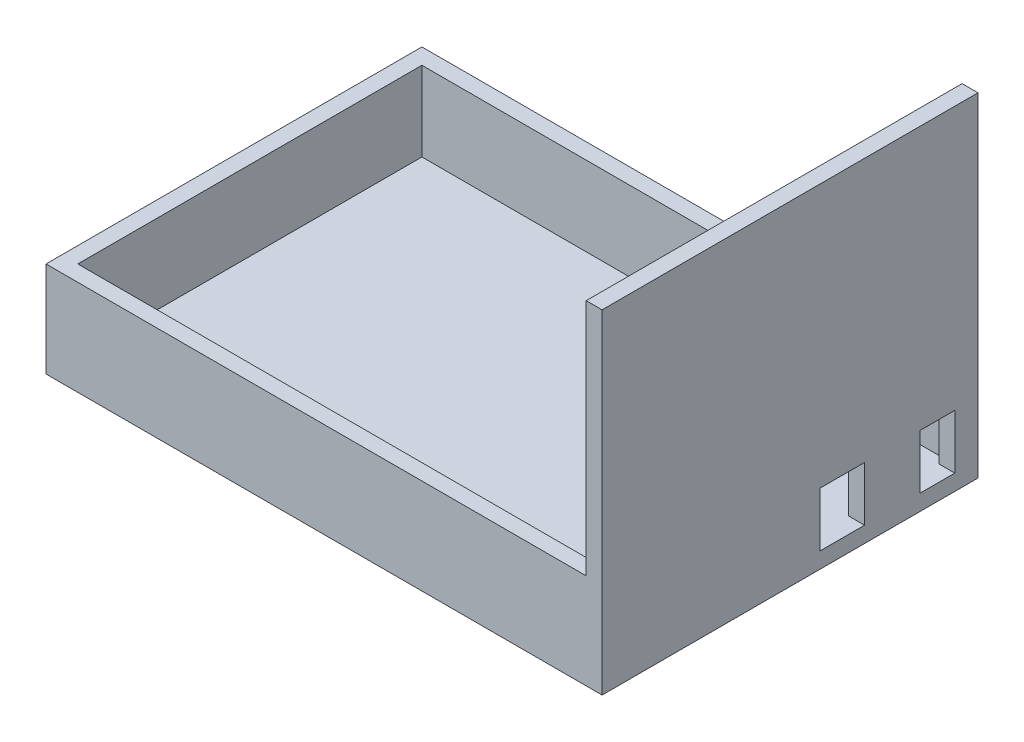
ISO-10303-21;
HEADER;
FILE_DESCRIPTION(('STEP AP214'),'2;1');
FILE_NAME('part.step','',(''),(''),'','','');
FILE_SCHEMA(('AUTOMOTIVE_DESIGN { 1 0 10303 214 1 1 1 1 }'));
ENDSEC;
DATA;
#1=APPLICATION_CONTEXT('core data for automotive mechanical design processes');
#2=APPLICATION_PROTOCOL_DEFINITION('international standard','automotive_design',2000,#1);
#3=PRODUCT_CONTEXT('',#1,'mechanical');
#4=PRODUCT('Part','Part','',(#3));
#5=PRODUCT_RELATED_PRODUCT_CATEGORY('part','',(#4));
#6=PRODUCT_DEFINITION_FORMATION('','',#4);
#7=PRODUCT_DEFINITION_CONTEXT('part definition',#1,'design');
#8=PRODUCT_DEFINITION('design','',#6,#7);
#9=PRODUCT_DEFINITION_SHAPE('','',#8);
#10=(LENGTH_UNIT() NAMED_UNIT(*) SI_UNIT(.MILLI.,.METRE.));
#11=(NAMED_UNIT(*) PLANE_ANGLE_UNIT() SI_UNIT($,.RADIAN.));
#12=(NAMED_UNIT(*) SI_UNIT($,.STERADIAN.) SOLID_ANGLE_UNIT());
#13=UNCERTAINTY_MEASURE_WITH_UNIT(LENGTH_MEASURE(1.E-05),#10,'distance_accuracy_value','');
#14=(GEOMETRIC_REPRESENTATION_CONTEXT(3) GLOBAL_UNCERTAINTY_ASSIGNED_CONTEXT((#13)) GLOBAL_UNIT_ASSIGNED_CONTEXT((#10,
#11,#12)) REPRESENTATION_CONTEXT('',''));
#15=CARTESIAN_POINT('',(0.,0.,0.));
#16=DIRECTION('',(0.,0.,1.));
#17=DIRECTION('',(1.,0.,0.));
#18=AXIS2_PLACEMENT_3D('',#15,#16,#17);
#19=CARTESIAN_POINT('',(0.,5.,0.));
#20=DIRECTION('',(0.,1.,0.));
#21=DIRECTION('',(0.,0.,1.));
#22=AXIS2_PLACEMENT_3D('',#19,#20,#21);
#23=PLANE('',#22);
#24=DIRECTION('',(0.,0.,1.));
#25=VECTOR('',#24,1.);
#26=CARTESIAN_POINT('',(82.5,5.,-59.15));
#27=LINE('',#26,#25);
#28=CARTESIAN_POINT('',(82.5,5.,-54.15));
#29=VERTEX_POINT('',#28);
#30=CARTESIAN_POINT('',(82.5,5.,-51.85));
#31=VERTEX_POINT('',#30);
#32=EDGE_CURVE('E249',#29,#31,#27,.T.);
#33=ORIENTED_EDGE('',*,*,#32,.F.);
#34=DIRECTION('',(1.,0.,0.));
#35=VECTOR('',#34,1.);
#36=CARTESIAN_POINT('',(-82.5,5.,-54.15));
#37=LINE('',#36,#35);
#38=CARTESIAN_POINT('',(-82.5,5.,-54.15));
#39=VERTEX_POINT('',#38);
#40=EDGE_CURVE('E211',#39,#29,#37,.T.);
#41=ORIENTED_EDGE('',*,*,#40,.F.);
#42=DIRECTION('',(0.,0.,-1.));
#43=VECTOR('',#42,1.);
#44=CARTESIAN_POINT('',(-82.5,5.,-59.15));
#45=LINE('',#44,#43);
#46=CARTESIAN_POINT('',(-82.5,5.,54.15));
#47=VERTEX_POINT('',#46);
#48=EDGE_CURVE('E264',#47,#39,#45,.T.);
#49=ORIENTED_EDGE('',*,*,#48,.F.);
#50=DIRECTION('',(-1.,0.,0.));
#51=VECTOR('',#50,1.);
#52=CARTESIAN_POINT('',(-82.5,5.,54.15));
#53=LINE('',#52,#51);
#54=CARTESIAN_POINT('',(82.5,5.,54.15));
#55=VERTEX_POINT('',#54);
#56=EDGE_CURVE('E230',#55,#47,#53,.T.);
#57=ORIENTED_EDGE('',*,*,#56,.F.);
#58=CARTESIAN_POINT('',(82.5,5.,-9.44999999999999));
#59=VERTEX_POINT('',#58);
#60=EDGE_CURVE('E244',#59,#55,#27,.T.);
#61=ORIENTED_EDGE('',*,*,#60,.F.);
#62=DIRECTION('',(1.,0.,0.));
#63=VECTOR('',#62,1.);
#64=CARTESIAN_POINT('',(-87.501,5.,-9.44999999999999));
#65=LINE('',#64,#63);
#66=CARTESIAN_POINT('',(87.5,5.,-9.44999999999999));
#67=VERTEX_POINT('',#66);
#68=EDGE_CURVE('E214',#59,#67,#65,.T.);
#69=ORIENTED_EDGE('',*,*,#68,.T.);
#70=DIRECTION('',(0.,0.,-1.));
#71=VECTOR('',#70,1.);
#72=CARTESIAN_POINT('',(87.5,5.,-23.45));
#73=LINE('',#72,#71);
#74=CARTESIAN_POINT('',(87.5,5.,-23.45));
#75=VERTEX_POINT('',#74);
#76=EDGE_CURVE('E195',#67,#75,#73,.T.);
#77=ORIENTED_EDGE('',*,*,#76,.T.);
#78=DIRECTION('',(1.,0.,0.));
#79=VECTOR('',#78,1.);
#80=CARTESIAN_POINT('',(-87.501,5.,-23.45));
#81=LINE('',#80,#79);
#82=CARTESIAN_POINT('',(82.5,5.,-23.45));
#83=VERTEX_POINT('',#82);
#84=EDGE_CURVE('E212',#83,#75,#81,.T.);
#85=ORIENTED_EDGE('',*,*,#84,.F.);
#86=CARTESIAN_POINT('',(82.5,5.,-40.95));
#87=VERTEX_POINT('',#86);
#88=EDGE_CURVE('E258',#87,#83,#27,.T.);
#89=ORIENTED_EDGE('',*,*,#88,.F.);
#90=DIRECTION('',(1.,0.,0.));
#91=VECTOR('',#90,1.);
#92=CARTESIAN_POINT('',(-87.501,5.,-40.95));
#93=LINE('',#92,#91);
#94=CARTESIAN_POINT('',(87.5,5.,-40.95));
#95=VERTEX_POINT('',#94);
#96=EDGE_CURVE('E172',#87,#95,#93,.T.);
#97=ORIENTED_EDGE('',*,*,#96,.T.);
#98=DIRECTION('',(0.,0.,-1.));
#99=VECTOR('',#98,1.);
#100=CARTESIAN_POINT('',(87.5,5.,-40.95));
#101=LINE('',#100,#99);
#102=CARTESIAN_POINT('',(87.5,5.,-51.85));
#103=VERTEX_POINT('',#102);
#104=EDGE_CURVE('E533',#95,#103,#101,.T.);
#105=ORIENTED_EDGE('',*,*,#104,.T.);
#106=DIRECTION('',(1.,0.,0.));
#107=VECTOR('',#106,1.);
#108=CARTESIAN_POINT('',(-87.501,5.,-51.85));
#109=LINE('',#108,#107);
#110=EDGE_CURVE('E188',#31,#103,#109,.T.);
#111=ORIENTED_EDGE('',*,*,#110,.F.);
#112=EDGE_LOOP('',(#33,#41,#49,#57,#61,#69,#77,#85,#89,#97,#105,#111));
#113=FACE_BOUND('',#112,.T.);
#114=ADVANCED_FACE('F39',(#113),#23,.T.);
#115=CARTESIAN_POINT('',(-82.5,30.,-59.15));
#116=DIRECTION('',(-1.,0.,0.));
#117=DIRECTION('',(0.,0.,1.));
#118=AXIS2_PLACEMENT_3D('',#115,#116,#117);
#119=PLANE('',#118);
#120=DIRECTION('',(0.,-1.,0.));
#121=VECTOR('',#120,1.);
#122=CARTESIAN_POINT('',(-82.5,30.,-54.15));
#123=LINE('',#122,#121);
#124=CARTESIAN_POINT('',(-82.5,30.,-54.15));
#125=VERTEX_POINT('',#124);
#126=EDGE_CURVE('E228',#125,#39,#123,.T.);
#127=ORIENTED_EDGE('',*,*,#126,.F.);
#128=DIRECTION('',(0.,0.,-1.));
#129=VECTOR('',#128,1.);
#130=CARTESIAN_POINT('',(-82.5,30.,-59.15));
#131=LINE('',#130,#129);
#132=CARTESIAN_POINT('',(-82.5,30.,54.15));
#133=VERTEX_POINT('',#132);
#134=EDGE_CURVE('E270',#133,#125,#131,.T.);
#135=ORIENTED_EDGE('',*,*,#134,.F.);
#136=DIRECTION('',(0.,-1.,0.));
#137=VECTOR('',#136,1.);
#138=CARTESIAN_POINT('',(-82.5,30.,54.15));
#139=LINE('',#138,#137);
#140=EDGE_CURVE('E237',#133,#47,#139,.T.);
#141=ORIENTED_EDGE('',*,*,#140,.T.);
#142=ORIENTED_EDGE('',*,*,#48,.T.);
#143=EDGE_LOOP('',(#127,#135,#141,#142));
#144=FACE_BOUND('',#143,.T.);
#145=ADVANCED_FACE('F325',(#144),#119,.F.);
#146=CARTESIAN_POINT('',(82.5,105.,-59.15));
#147=DIRECTION('',(1.,0.,0.));
#148=DIRECTION('',(0.,0.,-1.));
#149=AXIS2_PLACEMENT_3D('',#146,#147,#148);
#150=PLANE('',#149);
#151=DIRECTION('',(0.,0.,-1.));
#152=VECTOR('',#151,1.);
#153=CARTESIAN_POINT('',(82.5,22.1,-40.95));
#154=LINE('',#153,#152);
#155=CARTESIAN_POINT('',(82.5,22.1,-40.95));
#156=VERTEX_POINT('',#155);
#157=CARTESIAN_POINT('',(82.5,22.1,-51.85));
#158=VERTEX_POINT('',#157);
#159=EDGE_CURVE('E168',#156,#158,#154,.T.);
#160=ORIENTED_EDGE('',*,*,#159,.F.);
#161=DIRECTION('',(0.,1.,0.));
#162=VECTOR('',#161,1.);
#163=CARTESIAN_POINT('',(82.5,22.1,-40.95));
#164=LINE('',#163,#162);
#165=EDGE_CURVE('E175',#87,#156,#164,.T.);
#166=ORIENTED_EDGE('',*,*,#165,.F.);
#167=ORIENTED_EDGE('',*,*,#88,.T.);
#168=DIRECTION('',(0.,-1.,0.));
#169=VECTOR('',#168,1.);
#170=CARTESIAN_POINT('',(82.5,22.1,-23.45));
#171=LINE('',#170,#169);
#172=CARTESIAN_POINT('',(82.5,22.1,-23.45));
#173=VERTEX_POINT('',#172);
#174=EDGE_CURVE('E194',#173,#83,#171,.T.);
#175=ORIENTED_EDGE('',*,*,#174,.F.);
#176=DIRECTION('',(0.,0.,-1.));
#177=VECTOR('',#176,1.);
#178=CARTESIAN_POINT('',(82.5,22.1,-23.45));
#179=LINE('',#178,#177);
#180=CARTESIAN_POINT('',(82.5,22.1,-9.44999999999999));
#181=VERTEX_POINT('',#180);
#182=EDGE_CURVE('E191',#181,#173,#179,.T.);
#183=ORIENTED_EDGE('',*,*,#182,.F.);
#184=DIRECTION('',(0.,1.,0.));
#185=VECTOR('',#184,1.);
#186=CARTESIAN_POINT('',(82.5,22.1,-9.44999999999999));
#187=LINE('',#186,#185);
#188=EDGE_CURVE('E209',#59,#181,#187,.T.);
#189=ORIENTED_EDGE('',*,*,#188,.F.);
#190=ORIENTED_EDGE('',*,*,#60,.T.);
#191=DIRECTION('',(0.,-1.,0.));
#192=VECTOR('',#191,1.);
#193=CARTESIAN_POINT('',(82.5,30.,54.15));
#194=LINE('',#193,#192);
#195=CARTESIAN_POINT('',(82.5,30.,54.15));
#196=VERTEX_POINT('',#195);
#197=EDGE_CURVE('E241',#196,#55,#194,.T.);
#198=ORIENTED_EDGE('',*,*,#197,.F.);
#199=DIRECTION('',(0.,0.,-1.));
#200=VECTOR('',#199,1.);
#201=CARTESIAN_POINT('',(82.5,30.,59.15));
#202=LINE('',#201,#200);
#203=CARTESIAN_POINT('',(82.5,30.,59.15));
#204=VERTEX_POINT('',#203);
#205=EDGE_CURVE('E231',#204,#196,#202,.T.);
#206=ORIENTED_EDGE('',*,*,#205,.F.);
#207=DIRECTION('',(0.,-1.,0.));
#208=VECTOR('',#207,1.);
#209=CARTESIAN_POINT('',(82.5,105.,59.15));
#210=LINE('',#209,#208);
#211=CARTESIAN_POINT('',(82.5,105.,59.15));
#212=VERTEX_POINT('',#211);
#213=EDGE_CURVE('E256',#212,#204,#210,.T.);
#214=ORIENTED_EDGE('',*,*,#213,.F.);
#215=DIRECTION('',(0.,0.,1.));
#216=VECTOR('',#215,1.);
#217=CARTESIAN_POINT('',(82.5,105.,-59.15));
#218=LINE('',#217,#216);
#219=CARTESIAN_POINT('',(82.5,105.,-59.15));
#220=VERTEX_POINT('',#219);
#221=EDGE_CURVE('E251',#220,#212,#218,.T.);
#222=ORIENTED_EDGE('',*,*,#221,.F.);
#223=DIRECTION('',(0.,-1.,0.));
#224=VECTOR('',#223,1.);
#225=CARTESIAN_POINT('',(82.5,105.,-59.15));
#226=LINE('',#225,#224);
#227=CARTESIAN_POINT('',(82.5,30.,-59.15));
#228=VERTEX_POINT('',#227);
#229=EDGE_CURVE('E261',#220,#228,#226,.T.);
#230=ORIENTED_EDGE('',*,*,#229,.T.);
#231=DIRECTION('',(0.,0.,-1.));
#232=VECTOR('',#231,1.);
#233=CARTESIAN_POINT('',(82.5,30.,-59.15));
#234=LINE('',#233,#232);
#235=CARTESIAN_POINT('',(82.5,30.,-54.15));
#236=VERTEX_POINT('',#235);
#237=EDGE_CURVE('E221',#236,#228,#234,.T.);
#238=ORIENTED_EDGE('',*,*,#237,.F.);
#239=DIRECTION('',(0.,-1.,0.));
#240=VECTOR('',#239,1.);
#241=CARTESIAN_POINT('',(82.5,30.,-54.15));
#242=LINE('',#241,#240);
#243=EDGE_CURVE('E224',#236,#29,#242,.T.);
#244=ORIENTED_EDGE('',*,*,#243,.T.);
#245=ORIENTED_EDGE('',*,*,#32,.T.);
#246=DIRECTION('',(0.,-1.,0.));
#247=VECTOR('',#246,1.);
#248=CARTESIAN_POINT('',(82.5,22.1,-51.85));
#249=LINE('',#248,#247);
#250=EDGE_CURVE('E54',#158,#31,#249,.T.);
#251=ORIENTED_EDGE('',*,*,#250,.F.);
#252=EDGE_LOOP('',(#160,#166,#167,#175,#183,#189,#190,#198,#206,#214,#222,#230,#238,#244,#245,#251));
#253=FACE_BOUND('',#252,.T.);
#254=ADVANCED_FACE('F180',(#253),#150,.F.);
#255=CARTESIAN_POINT('',(87.5,5.,-59.15));
#256=DIRECTION('',(-1.,0.,0.));
#257=DIRECTION('',(0.,0.,1.));
#258=AXIS2_PLACEMENT_3D('',#255,#256,#257);
#259=PLANE('',#258);
#260=ORIENTED_EDGE('',*,*,#104,.F.);
#261=DIRECTION('',(0.,-1.,0.));
#262=VECTOR('',#261,1.);
#263=CARTESIAN_POINT('',(87.5,22.1,-40.95));
#264=LINE('',#263,#262);
#265=CARTESIAN_POINT('',(87.5,22.1,-40.95));
#266=VERTEX_POINT('',#265);
#267=EDGE_CURVE('E62',#266,#95,#264,.T.);
#268=ORIENTED_EDGE('',*,*,#267,.F.);
#269=DIRECTION('',(0.,0.,1.));
#270=VECTOR('',#269,1.);
#271=CARTESIAN_POINT('',(87.5,22.1,-40.95));
#272=LINE('',#271,#270);
#273=CARTESIAN_POINT('',(87.5,22.1,-51.85));
#274=VERTEX_POINT('',#273);
#275=EDGE_CURVE('E170',#274,#266,#272,.T.);
#276=ORIENTED_EDGE('',*,*,#275,.F.);
#277=DIRECTION('',(0.,1.,0.));
#278=VECTOR('',#277,1.);
#279=CARTESIAN_POINT('',(87.5,22.1,-51.85));
#280=LINE('',#279,#278);
#281=EDGE_CURVE('E536',#103,#274,#280,.T.);
#282=ORIENTED_EDGE('',*,*,#281,.F.);
#283=EDGE_LOOP('',(#260,#268,#276,#282));
#284=FACE_BOUND('',#283,.T.);
#285=DIRECTION('',(0.,0.,1.));
#286=VECTOR('',#285,1.);
#287=CARTESIAN_POINT('',(87.5,22.1,-23.45));
#288=LINE('',#287,#286);
#289=CARTESIAN_POINT('',(87.5,22.1,-23.45));
#290=VERTEX_POINT('',#289);
#291=CARTESIAN_POINT('',(87.5,22.1,-9.44999999999999));
#292=VERTEX_POINT('',#291);
#293=EDGE_CURVE('E201',#290,#292,#288,.T.);
#294=ORIENTED_EDGE('',*,*,#293,.F.);
#295=DIRECTION('',(0.,1.,0.));
#296=VECTOR('',#295,1.);
#297=CARTESIAN_POINT('',(87.5,22.1,-23.45));
#298=LINE('',#297,#296);
#299=EDGE_CURVE('E204',#75,#290,#298,.T.);
#300=ORIENTED_EDGE('',*,*,#299,.F.);
#301=ORIENTED_EDGE('',*,*,#76,.F.);
#302=DIRECTION('',(0.,-1.,0.));
#303=VECTOR('',#302,1.);
#304=CARTESIAN_POINT('',(87.5,22.1,-9.44999999999999));
#305=LINE('',#304,#303);
#306=EDGE_CURVE('E198',#292,#67,#305,.T.);
#307=ORIENTED_EDGE('',*,*,#306,.F.);
#308=EDGE_LOOP('',(#294,#300,#301,#307));
#309=FACE_BOUND('',#308,.T.);
#310=DIRECTION('',(0.,0.,-1.));
#311=VECTOR('',#310,1.);
#312=CARTESIAN_POINT('',(87.5,0.,-59.15));
#313=LINE('',#312,#311);
#314=CARTESIAN_POINT('',(87.5,0.,59.15));
#315=VERTEX_POINT('',#314);
#316=CARTESIAN_POINT('',(87.5,0.,-59.15));
#317=VERTEX_POINT('',#316);
#318=EDGE_CURVE('E276',#315,#317,#313,.T.);
#319=ORIENTED_EDGE('',*,*,#318,.T.);
#320=DIRECTION('',(0.,-1.,0.));
#321=VECTOR('',#320,1.);
#322=CARTESIAN_POINT('',(87.5,5.,-59.15));
#323=LINE('',#322,#321);
#324=CARTESIAN_POINT('',(87.5,105.,-59.15));
#325=VERTEX_POINT('',#324);
#326=EDGE_CURVE('E11',#325,#317,#323,.T.);
#327=ORIENTED_EDGE('',*,*,#326,.F.);
#328=DIRECTION('',(0.,0.,-1.));
#329=VECTOR('',#328,1.);
#330=CARTESIAN_POINT('',(87.5,105.,-59.15));
#331=LINE('',#330,#329);
#332=CARTESIAN_POINT('',(87.5,105.,59.15));
#333=VERTEX_POINT('',#332);
#334=EDGE_CURVE('E245',#333,#325,#331,.T.);
#335=ORIENTED_EDGE('',*,*,#334,.F.);
#336=DIRECTION('',(0.,-1.,0.));
#337=VECTOR('',#336,1.);
#338=CARTESIAN_POINT('',(87.5,5.,59.15));
#339=LINE('',#338,#337);
#340=EDGE_CURVE('E287',#333,#315,#339,.T.);
#341=ORIENTED_EDGE('',*,*,#340,.T.);
#342=EDGE_LOOP('',(#319,#327,#335,#341));
#343=FACE_BOUND('',#342,.T.);
#344=ADVANCED_FACE('F41',(#284,#309,#343),#259,.F.);
#345=CARTESIAN_POINT('',(-87.5,5.,-59.15));
#346=DIRECTION('',(0.,0.,1.));
#347=DIRECTION('',(1.,0.,0.));
#348=AXIS2_PLACEMENT_3D('',#345,#346,#347);
#349=PLANE('',#348);
#350=DIRECTION('',(-1.,0.,0.));
#351=VECTOR('',#350,1.);
#352=CARTESIAN_POINT('',(-87.5,0.,-59.15));
#353=LINE('',#352,#351);
#354=CARTESIAN_POINT('',(-87.5,0.,-59.15));
#355=VERTEX_POINT('',#354);
#356=EDGE_CURVE('E281',#317,#355,#353,.T.);
#357=ORIENTED_EDGE('',*,*,#356,.T.);
#358=DIRECTION('',(0.,-1.,0.));
#359=VECTOR('',#358,1.);
#360=CARTESIAN_POINT('',(-87.5,5.,-59.15));
#361=LINE('',#360,#359);
#362=CARTESIAN_POINT('',(-87.5,30.,-59.15));
#363=VERTEX_POINT('',#362);
#364=EDGE_CURVE('E47',#363,#355,#361,.T.);
#365=ORIENTED_EDGE('',*,*,#364,.F.);
#366=DIRECTION('',(-1.,0.,0.));
#367=VECTOR('',#366,1.);
#368=CARTESIAN_POINT('',(-87.5,30.,-59.15));
#369=LINE('',#368,#367);
#370=EDGE_CURVE('E273',#228,#363,#369,.T.);
#371=ORIENTED_EDGE('',*,*,#370,.F.);
#372=ORIENTED_EDGE('',*,*,#229,.F.);
#373=DIRECTION('',(-1.,0.,0.));
#374=VECTOR('',#373,1.);
#375=CARTESIAN_POINT('',(87.5,105.,-59.15));
#376=LINE('',#375,#374);
#377=EDGE_CURVE('E248',#325,#220,#376,.T.);
#378=ORIENTED_EDGE('',*,*,#377,.F.);
#379=ORIENTED_EDGE('',*,*,#326,.T.);
#380=EDGE_LOOP('',(#357,#365,#371,#372,#378,#379));
#381=FACE_BOUND('',#380,.T.);
#382=ADVANCED_FACE('F334',(#381),#349,.F.);
#383=CARTESIAN_POINT('',(-87.5,5.,-59.15));
#384=DIRECTION('',(1.,0.,0.));
#385=DIRECTION('',(0.,0.,-1.));
#386=AXIS2_PLACEMENT_3D('',#383,#384,#385);
#387=PLANE('',#386);
#388=DIRECTION('',(0.,0.,1.));
#389=VECTOR('',#388,1.);
#390=CARTESIAN_POINT('',(-87.5,0.,-59.15));
#391=LINE('',#390,#389);
#392=CARTESIAN_POINT('',(-87.5,0.,59.15));
#393=VERTEX_POINT('',#392);
#394=EDGE_CURVE('E283',#355,#393,#391,.T.);
#395=ORIENTED_EDGE('',*,*,#394,.T.);
#396=DIRECTION('',(0.,-1.,0.));
#397=VECTOR('',#396,1.);
#398=CARTESIAN_POINT('',(-87.5,5.,59.15));
#399=LINE('',#398,#397);
#400=CARTESIAN_POINT('',(-87.5,30.,59.15));
#401=VERTEX_POINT('',#400);
#402=EDGE_CURVE('E290',#401,#393,#399,.T.);
#403=ORIENTED_EDGE('',*,*,#402,.F.);
#404=DIRECTION('',(0.,0.,1.));
#405=VECTOR('',#404,1.);
#406=CARTESIAN_POINT('',(-87.5,30.,-59.15));
#407=LINE('',#406,#405);
#408=EDGE_CURVE('E265',#363,#401,#407,.T.);
#409=ORIENTED_EDGE('',*,*,#408,.F.);
#410=ORIENTED_EDGE('',*,*,#364,.T.);
#411=EDGE_LOOP('',(#395,#403,#409,#410));
#412=FACE_BOUND('',#411,.T.);
#413=ADVANCED_FACE('F296',(#412),#387,.F.);
#414=CARTESIAN_POINT('',(-87.5,5.,59.15));
#415=DIRECTION('',(0.,0.,-1.));
#416=DIRECTION('',(-1.,0.,0.));
#417=AXIS2_PLACEMENT_3D('',#414,#415,#416);
#418=PLANE('',#417);
#419=DIRECTION('',(1.,0.,0.));
#420=VECTOR('',#419,1.);
#421=CARTESIAN_POINT('',(-87.5,0.,59.15));
#422=LINE('',#421,#420);
#423=EDGE_CURVE('E285',#393,#315,#422,.T.);
#424=ORIENTED_EDGE('',*,*,#423,.T.);
#425=ORIENTED_EDGE('',*,*,#340,.F.);
#426=DIRECTION('',(1.,0.,0.));
#427=VECTOR('',#426,1.);
#428=CARTESIAN_POINT('',(87.5,105.,59.15));
#429=LINE('',#428,#427);
#430=EDGE_CURVE('E253',#212,#333,#429,.T.);
#431=ORIENTED_EDGE('',*,*,#430,.F.);
#432=ORIENTED_EDGE('',*,*,#213,.T.);
#433=DIRECTION('',(1.,0.,0.));
#434=VECTOR('',#433,1.);
#435=CARTESIAN_POINT('',(-87.5,30.,59.15));
#436=LINE('',#435,#434);
#437=EDGE_CURVE('E268',#401,#204,#436,.T.);
#438=ORIENTED_EDGE('',*,*,#437,.F.);
#439=ORIENTED_EDGE('',*,*,#402,.T.);
#440=EDGE_LOOP('',(#424,#425,#431,#432,#438,#439));
#441=FACE_BOUND('',#440,.T.);
#442=ADVANCED_FACE('F303',(#441),#418,.F.);
#443=CARTESIAN_POINT('',(0.,0.,0.));
#444=DIRECTION('',(0.,1.,0.));
#445=DIRECTION('',(0.,0.,1.));
#446=AXIS2_PLACEMENT_3D('',#443,#444,#445);
#447=PLANE('',#446);
#448=ORIENTED_EDGE('',*,*,#318,.F.);
#449=ORIENTED_EDGE('',*,*,#423,.F.);
#450=ORIENTED_EDGE('',*,*,#394,.F.);
#451=ORIENTED_EDGE('',*,*,#356,.F.);
#452=EDGE_LOOP('',(#448,#449,#450,#451));
#453=FACE_BOUND('',#452,.T.);
#454=ADVANCED_FACE('F301',(#453),#447,.F.);
#455=CARTESIAN_POINT('',(0.,30.,0.));
#456=DIRECTION('',(0.,1.,0.));
#457=DIRECTION('',(0.,0.,1.));
#458=AXIS2_PLACEMENT_3D('',#455,#456,#457);
#459=PLANE('',#458);
#460=ORIENTED_EDGE('',*,*,#408,.T.);
#461=ORIENTED_EDGE('',*,*,#437,.T.);
#462=ORIENTED_EDGE('',*,*,#205,.T.);
#463=DIRECTION('',(-1.,0.,0.));
#464=VECTOR('',#463,1.);
#465=CARTESIAN_POINT('',(-82.5,30.,54.15));
#466=LINE('',#465,#464);
#467=EDGE_CURVE('E234',#196,#133,#466,.T.);
#468=ORIENTED_EDGE('',*,*,#467,.T.);
#469=ORIENTED_EDGE('',*,*,#134,.T.);
#470=DIRECTION('',(1.,0.,0.));
#471=VECTOR('',#470,1.);
#472=CARTESIAN_POINT('',(-82.5,30.,-54.15));
#473=LINE('',#472,#471);
#474=EDGE_CURVE('E219',#125,#236,#473,.T.);
#475=ORIENTED_EDGE('',*,*,#474,.T.);
#476=ORIENTED_EDGE('',*,*,#237,.T.);
#477=ORIENTED_EDGE('',*,*,#370,.T.);
#478=EDGE_LOOP('',(#460,#461,#462,#468,#469,#475,#476,#477));
#479=FACE_BOUND('',#478,.T.);
#480=ADVANCED_FACE('F317',(#479),#459,.T.);
#481=CARTESIAN_POINT('',(0.,105.,0.));
#482=DIRECTION('',(0.,-1.,0.));
#483=DIRECTION('',(0.,0.,-1.));
#484=AXIS2_PLACEMENT_3D('',#481,#482,#483);
#485=PLANE('',#484);
#486=ORIENTED_EDGE('',*,*,#334,.T.);
#487=ORIENTED_EDGE('',*,*,#377,.T.);
#488=ORIENTED_EDGE('',*,*,#221,.T.);
#489=ORIENTED_EDGE('',*,*,#430,.T.);
#490=EDGE_LOOP('',(#486,#487,#488,#489));
#491=FACE_BOUND('',#490,.T.);
#492=ADVANCED_FACE('F310',(#491),#485,.F.);
#493=CARTESIAN_POINT('',(-82.5,30.,54.15));
#494=DIRECTION('',(0.,0.,1.));
#495=DIRECTION('',(0.,-1.,0.));
#496=AXIS2_PLACEMENT_3D('',#493,#494,#495);
#497=PLANE('',#496);
#498=ORIENTED_EDGE('',*,*,#56,.T.);
#499=ORIENTED_EDGE('',*,*,#140,.F.);
#500=ORIENTED_EDGE('',*,*,#467,.F.);
#501=ORIENTED_EDGE('',*,*,#197,.T.);
#502=EDGE_LOOP('',(#498,#499,#500,#501));
#503=FACE_BOUND('',#502,.T.);
#504=ADVANCED_FACE('F320',(#503),#497,.F.);
#505=CARTESIAN_POINT('',(-82.5,30.,-54.15));
#506=DIRECTION('',(0.,0.,-1.));
#507=DIRECTION('',(0.,1.,0.));
#508=AXIS2_PLACEMENT_3D('',#505,#506,#507);
#509=PLANE('',#508);
#510=ORIENTED_EDGE('',*,*,#40,.T.);
#511=ORIENTED_EDGE('',*,*,#243,.F.);
#512=ORIENTED_EDGE('',*,*,#474,.F.);
#513=ORIENTED_EDGE('',*,*,#126,.T.);
#514=EDGE_LOOP('',(#510,#511,#512,#513));
#515=FACE_BOUND('',#514,.T.);
#516=ADVANCED_FACE('F332',(#515),#509,.F.);
#517=CARTESIAN_POINT('',(-87.501,22.1,-23.45));
#518=DIRECTION('',(0.,0.,-1.));
#519=DIRECTION('',(0.,1.,0.));
#520=AXIS2_PLACEMENT_3D('',#517,#518,#519);
#521=PLANE('',#520);
#522=ORIENTED_EDGE('',*,*,#174,.T.);
#523=ORIENTED_EDGE('',*,*,#84,.T.);
#524=ORIENTED_EDGE('',*,*,#299,.T.);
#525=DIRECTION('',(1.,0.,0.));
#526=VECTOR('',#525,1.);
#527=CARTESIAN_POINT('',(-87.501,22.1,-23.45));
#528=LINE('',#527,#526);
#529=EDGE_CURVE('E183',#173,#290,#528,.T.);
#530=ORIENTED_EDGE('',*,*,#529,.F.);
#531=EDGE_LOOP('',(#522,#523,#524,#530));
#532=FACE_BOUND('',#531,.T.);
#533=ADVANCED_FACE('F388',(#532),#521,.F.);
#534=CARTESIAN_POINT('',(-87.501,22.1,-9.44999999999999));
#535=DIRECTION('',(0.,0.,1.));
#536=DIRECTION('',(0.,-1.,0.));
#537=AXIS2_PLACEMENT_3D('',#534,#535,#536);
#538=PLANE('',#537);
#539=ORIENTED_EDGE('',*,*,#188,.T.);
#540=DIRECTION('',(1.,0.,0.));
#541=VECTOR('',#540,1.);
#542=CARTESIAN_POINT('',(-87.501,22.1,-9.44999999999999));
#543=LINE('',#542,#541);
#544=EDGE_CURVE('E206',#181,#292,#543,.T.);
#545=ORIENTED_EDGE('',*,*,#544,.T.);
#546=ORIENTED_EDGE('',*,*,#306,.T.);
#547=ORIENTED_EDGE('',*,*,#68,.F.);
#548=EDGE_LOOP('',(#539,#545,#546,#547));
#549=FACE_BOUND('',#548,.T.);
#550=ADVANCED_FACE('F395',(#549),#538,.F.);
#551=CARTESIAN_POINT('',(-87.501,22.1,-23.45));
#552=DIRECTION('',(0.,1.,0.));
#553=DIRECTION('',(0.,0.,1.));
#554=AXIS2_PLACEMENT_3D('',#551,#552,#553);
#555=PLANE('',#554);
#556=ORIENTED_EDGE('',*,*,#182,.T.);
#557=ORIENTED_EDGE('',*,*,#529,.T.);
#558=ORIENTED_EDGE('',*,*,#293,.T.);
#559=ORIENTED_EDGE('',*,*,#544,.F.);
#560=EDGE_LOOP('',(#556,#557,#558,#559));
#561=FACE_BOUND('',#560,.T.);
#562=ADVANCED_FACE('F402',(#561),#555,.F.);
#563=CARTESIAN_POINT('',(-87.501,22.1,-40.95));
#564=DIRECTION('',(0.,0.,1.));
#565=DIRECTION('',(1.,0.,0.));
#566=AXIS2_PLACEMENT_3D('',#563,#564,#565);
#567=PLANE('',#566);
#568=ORIENTED_EDGE('',*,*,#165,.T.);
#569=DIRECTION('',(1.,0.,0.));
#570=VECTOR('',#569,1.);
#571=CARTESIAN_POINT('',(-87.501,22.1,-40.95));
#572=LINE('',#571,#570);
#573=EDGE_CURVE('E164',#156,#266,#572,.T.);
#574=ORIENTED_EDGE('',*,*,#573,.T.);
#575=ORIENTED_EDGE('',*,*,#267,.T.);
#576=ORIENTED_EDGE('',*,*,#96,.F.);
#577=EDGE_LOOP('',(#568,#574,#575,#576));
#578=FACE_BOUND('',#577,.T.);
#579=ADVANCED_FACE('F176',(#578),#567,.F.);
#580=CARTESIAN_POINT('',(-87.501,22.1,-40.95));
#581=DIRECTION('',(0.,1.,0.));
#582=DIRECTION('',(0.,0.,1.));
#583=AXIS2_PLACEMENT_3D('',#580,#581,#582);
#584=PLANE('',#583);
#585=ORIENTED_EDGE('',*,*,#159,.T.);
#586=DIRECTION('',(1.,0.,0.));
#587=VECTOR('',#586,1.);
#588=CARTESIAN_POINT('',(-87.501,22.1,-51.85));
#589=LINE('',#588,#587);
#590=EDGE_CURVE('E171',#158,#274,#589,.T.);
#591=ORIENTED_EDGE('',*,*,#590,.T.);
#592=ORIENTED_EDGE('',*,*,#275,.T.);
#593=ORIENTED_EDGE('',*,*,#573,.F.);
#594=EDGE_LOOP('',(#585,#591,#592,#593));
#595=FACE_BOUND('',#594,.T.);
#596=ADVANCED_FACE('F166',(#595),#584,.F.);
#597=CARTESIAN_POINT('',(-87.501,22.1,-51.85));
#598=DIRECTION('',(0.,0.,-1.));
#599=DIRECTION('',(-1.,0.,0.));
#600=AXIS2_PLACEMENT_3D('',#597,#598,#599);
#601=PLANE('',#600);
#602=ORIENTED_EDGE('',*,*,#250,.T.);
#603=ORIENTED_EDGE('',*,*,#110,.T.);
#604=ORIENTED_EDGE('',*,*,#281,.T.);
#605=ORIENTED_EDGE('',*,*,#590,.F.);
#606=EDGE_LOOP('',(#602,#603,#604,#605));
#607=FACE_BOUND('',#606,.T.);
#608=ADVANCED_FACE('F441',(#607),#601,.F.);
#609=CLOSED_SHELL('',(#114,#145,#254,#344,#382,#413,#442,#454,#480,#492,#504,#516,#533,#550,
#562,#579,#596,#608));
#610=MANIFOLD_SOLID_BREP('B2',#609);
#611=ADVANCED_BREP_SHAPE_REPRESENTATION('',(#18,#610),#14);
#612=SHAPE_DEFINITION_REPRESENTATION(#9,#611);
ENDSEC;
END-ISO-10303-21;
